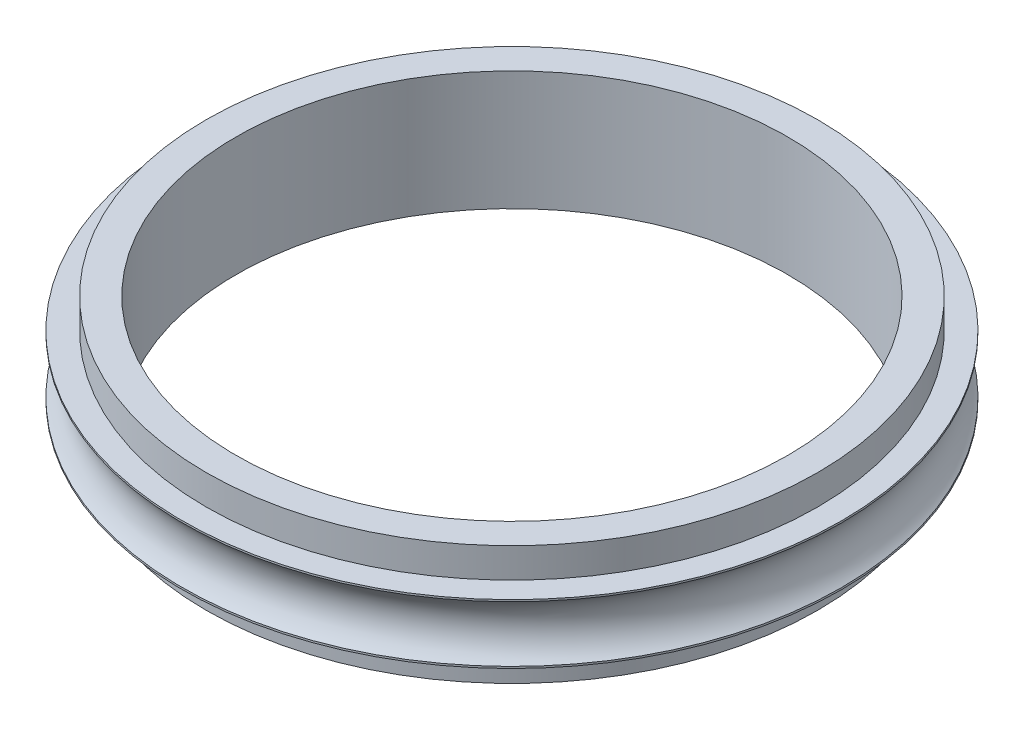
ISO-10303-21;
HEADER;
FILE_DESCRIPTION(('STEP AP214'),'2;1');
FILE_NAME('part.step','',(''),(''),'','','');
FILE_SCHEMA(('AUTOMOTIVE_DESIGN { 1 0 10303 214 1 1 1 1 }'));
ENDSEC;
DATA;
#1=APPLICATION_CONTEXT('core data for automotive mechanical design processes');
#2=APPLICATION_PROTOCOL_DEFINITION('international standard','automotive_design',2000,#1);
#3=PRODUCT_CONTEXT('',#1,'mechanical');
#4=PRODUCT('Part','Part','',(#3));
#5=PRODUCT_RELATED_PRODUCT_CATEGORY('part','',(#4));
#6=PRODUCT_DEFINITION_FORMATION('','',#4);
#7=PRODUCT_DEFINITION_CONTEXT('part definition',#1,'design');
#8=PRODUCT_DEFINITION('design','',#6,#7);
#9=PRODUCT_DEFINITION_SHAPE('','',#8);
#10=(LENGTH_UNIT() NAMED_UNIT(*) SI_UNIT(.MILLI.,.METRE.));
#11=(NAMED_UNIT(*) PLANE_ANGLE_UNIT() SI_UNIT($,.RADIAN.));
#12=(NAMED_UNIT(*) SI_UNIT($,.STERADIAN.) SOLID_ANGLE_UNIT());
#13=UNCERTAINTY_MEASURE_WITH_UNIT(LENGTH_MEASURE(1.E-05),#10,'distance_accuracy_value','');
#14=(GEOMETRIC_REPRESENTATION_CONTEXT(3) GLOBAL_UNCERTAINTY_ASSIGNED_CONTEXT((#13)) GLOBAL_UNIT_ASSIGNED_CONTEXT((#10,
#11,#12)) REPRESENTATION_CONTEXT('',''));
#15=CARTESIAN_POINT('',(0.,0.,0.));
#16=DIRECTION('',(0.,0.,1.));
#17=DIRECTION('',(1.,0.,0.));
#18=AXIS2_PLACEMENT_3D('',#15,#16,#17);
#19=CARTESIAN_POINT('',(23.75,4.4,0.));
#20=DIRECTION('',(0.,-1.,0.));
#21=DIRECTION('',(-1.,0.,0.));
#22=AXIS2_PLACEMENT_3D('',#19,#20,#21);
#23=CYLINDRICAL_SURFACE('',#22,20.5);
#24=CARTESIAN_POINT('',(23.75,2.,0.));
#25=DIRECTION('',(0.,-1.,0.));
#26=DIRECTION('',(-1.,0.,0.));
#27=AXIS2_PLACEMENT_3D('',#24,#25,#26);
#28=CIRCLE('',#27,20.5);
#29=CARTESIAN_POINT('',(44.25,2.,0.));
#30=VERTEX_POINT('',#29);
#31=EDGE_CURVE('E28',#30,#30,#28,.T.);
#32=ORIENTED_EDGE('',*,*,#31,.F.);
#33=DIRECTION('',(0.,1.,0.));
#34=VECTOR('',#33,1.);
#35=CARTESIAN_POINT('',(44.25,4.4,0.));
#36=LINE('',#35,#34);
#37=CARTESIAN_POINT('',(44.25,4.,0.));
#38=VERTEX_POINT('',#37);
#39=EDGE_CURVE('E11',#30,#38,#36,.T.);
#40=ORIENTED_EDGE('',*,*,#39,.T.);
#41=CARTESIAN_POINT('',(23.75,4.,0.));
#42=DIRECTION('',(0.,1.,0.));
#43=DIRECTION('',(-1.,0.,0.));
#44=AXIS2_PLACEMENT_3D('',#41,#42,#43);
#45=CIRCLE('',#44,20.5);
#46=EDGE_CURVE('E119',#38,#38,#45,.T.);
#47=ORIENTED_EDGE('',*,*,#46,.F.);
#48=ORIENTED_EDGE('',*,*,#39,.F.);
#49=EDGE_LOOP('',(#32,#40,#47,#48));
#50=FACE_BOUND('',#49,.T.);
#51=ADVANCED_FACE('F17',(#50),#23,.T.);
#52=CARTESIAN_POINT('',(23.75,2.,0.));
#53=DIRECTION('',(0.,-1.,0.));
#54=DIRECTION('',(0.,0.,-1.));
#55=AXIS2_PLACEMENT_3D('',#52,#53,#54);
#56=PLANE('',#55);
#57=ORIENTED_EDGE('',*,*,#31,.T.);
#58=EDGE_LOOP('',(#57));
#59=FACE_BOUND('',#58,.T.);
#60=CARTESIAN_POINT('',(23.75,2.,0.));
#61=DIRECTION('',(0.,-1.,0.));
#62=DIRECTION('',(-1.,0.,0.));
#63=AXIS2_PLACEMENT_3D('',#60,#61,#62);
#64=CIRCLE('',#63,22.1);
#65=CARTESIAN_POINT('',(45.85,2.,0.));
#66=VERTEX_POINT('',#65);
#67=EDGE_CURVE('E111',#66,#66,#64,.T.);
#68=ORIENTED_EDGE('',*,*,#67,.F.);
#69=EDGE_LOOP('',(#68));
#70=FACE_BOUND('',#69,.T.);
#71=ADVANCED_FACE('F155',(#59,#70),#56,.F.);
#72=CARTESIAN_POINT('',(23.75,4.4,0.));
#73=DIRECTION('',(0.,-1.,0.));
#74=DIRECTION('',(-1.,0.,0.));
#75=AXIS2_PLACEMENT_3D('',#72,#73,#74);
#76=CYLINDRICAL_SURFACE('',#75,22.1);
#77=CARTESIAN_POINT('',(23.75,1.878163997099,0.));
#78=DIRECTION('',(0.,-1.,0.));
#79=DIRECTION('',(-1.,0.,0.));
#80=AXIS2_PLACEMENT_3D('',#77,#78,#79);
#81=CIRCLE('',#80,22.1);
#82=CARTESIAN_POINT('',(45.85,1.878163997099,0.));
#83=VERTEX_POINT('',#82);
#84=EDGE_CURVE('E21',#83,#83,#81,.T.);
#85=ORIENTED_EDGE('',*,*,#84,.F.);
#86=DIRECTION('',(0.,1.,0.));
#87=VECTOR('',#86,1.);
#88=CARTESIAN_POINT('',(45.85,4.4,0.));
#89=LINE('',#88,#87);
#90=EDGE_CURVE('E107',#83,#66,#89,.T.);
#91=ORIENTED_EDGE('',*,*,#90,.T.);
#92=ORIENTED_EDGE('',*,*,#67,.T.);
#93=ORIENTED_EDGE('',*,*,#90,.F.);
#94=EDGE_LOOP('',(#85,#91,#92,#93));
#95=FACE_BOUND('',#94,.T.);
#96=ADVANCED_FACE('F19',(#95),#76,.T.);
#97=CARTESIAN_POINT('',(23.75,0.,0.));
#98=DIRECTION('',(0.,-1.,0.));
#99=DIRECTION('',(-1.,0.,0.));
#100=AXIS2_PLACEMENT_3D('',#97,#98,#99);
#101=TOROIDAL_SURFACE('',#100,23.75,2.5);
#102=CARTESIAN_POINT('',(23.75,-1.878163997099,0.));
#103=DIRECTION('',(0.,-1.,0.));
#104=DIRECTION('',(-1.,0.,0.));
#105=AXIS2_PLACEMENT_3D('',#102,#103,#104);
#106=CIRCLE('',#105,22.1);
#107=CARTESIAN_POINT('',(45.85,-1.878163997099,0.));
#108=VERTEX_POINT('',#107);
#109=EDGE_CURVE('E93',#108,#108,#106,.T.);
#110=ORIENTED_EDGE('',*,*,#109,.F.);
#111=CARTESIAN_POINT('',(47.5,0.,0.));
#112=DIRECTION('',(0.,0.,-1.));
#113=DIRECTION('',(1.,0.,0.));
#114=AXIS2_PLACEMENT_3D('',#111,#112,#113);
#115=CIRCLE('',#114,2.5);
#116=EDGE_CURVE('E127',#108,#83,#115,.T.);
#117=ORIENTED_EDGE('',*,*,#116,.T.);
#118=ORIENTED_EDGE('',*,*,#84,.T.);
#119=ORIENTED_EDGE('',*,*,#116,.F.);
#120=EDGE_LOOP('',(#110,#117,#118,#119));
#121=FACE_BOUND('',#120,.T.);
#122=ADVANCED_FACE('F151',(#121),#101,.F.);
#123=CARTESIAN_POINT('',(23.75,4.4,0.));
#124=DIRECTION('',(0.,-1.,0.));
#125=DIRECTION('',(-1.,0.,0.));
#126=AXIS2_PLACEMENT_3D('',#123,#124,#125);
#127=CYLINDRICAL_SURFACE('',#126,22.1);
#128=CARTESIAN_POINT('',(23.75,-2.,0.));
#129=DIRECTION('',(0.,-1.,0.));
#130=DIRECTION('',(-1.,0.,0.));
#131=AXIS2_PLACEMENT_3D('',#128,#129,#130);
#132=CIRCLE('',#131,22.1);
#133=CARTESIAN_POINT('',(45.85,-2.,0.));
#134=VERTEX_POINT('',#133);
#135=EDGE_CURVE('E91',#134,#134,#132,.T.);
#136=ORIENTED_EDGE('',*,*,#135,.F.);
#137=DIRECTION('',(0.,1.,0.));
#138=VECTOR('',#137,1.);
#139=CARTESIAN_POINT('',(45.85,4.4,0.));
#140=LINE('',#139,#138);
#141=EDGE_CURVE('E88',#134,#108,#140,.T.);
#142=ORIENTED_EDGE('',*,*,#141,.T.);
#143=ORIENTED_EDGE('',*,*,#109,.T.);
#144=ORIENTED_EDGE('',*,*,#141,.F.);
#145=EDGE_LOOP('',(#136,#142,#143,#144));
#146=FACE_BOUND('',#145,.T.);
#147=ADVANCED_FACE('F90',(#146),#127,.T.);
#148=CARTESIAN_POINT('',(23.75,-2.,0.));
#149=DIRECTION('',(0.,-1.,0.));
#150=DIRECTION('',(0.,0.,-1.));
#151=AXIS2_PLACEMENT_3D('',#148,#149,#150);
#152=PLANE('',#151);
#153=CARTESIAN_POINT('',(23.75,-2.,0.));
#154=DIRECTION('',(0.,-1.,0.));
#155=DIRECTION('',(-1.,0.,0.));
#156=AXIS2_PLACEMENT_3D('',#153,#154,#155);
#157=CIRCLE('',#156,20.5);
#158=CARTESIAN_POINT('',(44.25,-2.,0.));
#159=VERTEX_POINT('',#158);
#160=EDGE_CURVE('E99',#159,#159,#157,.T.);
#161=ORIENTED_EDGE('',*,*,#160,.F.);
#162=EDGE_LOOP('',(#161));
#163=FACE_BOUND('',#162,.T.);
#164=ORIENTED_EDGE('',*,*,#135,.T.);
#165=EDGE_LOOP('',(#164));
#166=FACE_BOUND('',#165,.T.);
#167=ADVANCED_FACE('F97',(#163,#166),#152,.T.);
#168=CARTESIAN_POINT('',(23.75,4.4,0.));
#169=DIRECTION('',(0.,-1.,0.));
#170=DIRECTION('',(-1.,0.,0.));
#171=AXIS2_PLACEMENT_3D('',#168,#169,#170);
#172=CYLINDRICAL_SURFACE('',#171,20.5);
#173=CARTESIAN_POINT('',(23.75,-4.,0.));
#174=DIRECTION('',(0.,-1.,0.));
#175=DIRECTION('',(-1.,0.,0.));
#176=AXIS2_PLACEMENT_3D('',#173,#174,#175);
#177=CIRCLE('',#176,20.5);
#178=CARTESIAN_POINT('',(44.25,-4.,0.));
#179=VERTEX_POINT('',#178);
#180=EDGE_CURVE('E112',#179,#179,#177,.T.);
#181=ORIENTED_EDGE('',*,*,#180,.F.);
#182=DIRECTION('',(0.,1.,0.));
#183=VECTOR('',#182,1.);
#184=CARTESIAN_POINT('',(44.25,4.4,0.));
#185=LINE('',#184,#183);
#186=EDGE_CURVE('E67',#179,#159,#185,.T.);
#187=ORIENTED_EDGE('',*,*,#186,.T.);
#188=ORIENTED_EDGE('',*,*,#160,.T.);
#189=ORIENTED_EDGE('',*,*,#186,.F.);
#190=EDGE_LOOP('',(#181,#187,#188,#189));
#191=FACE_BOUND('',#190,.T.);
#192=ADVANCED_FACE('F178',(#191),#172,.T.);
#193=CARTESIAN_POINT('',(23.75,-4.,0.));
#194=DIRECTION('',(0.,-1.,0.));
#195=DIRECTION('',(0.,0.,-1.));
#196=AXIS2_PLACEMENT_3D('',#193,#194,#195);
#197=PLANE('',#196);
#198=CARTESIAN_POINT('',(23.75,-4.,0.));
#199=DIRECTION('',(0.,-1.,0.));
#200=DIRECTION('',(-1.,0.,0.));
#201=AXIS2_PLACEMENT_3D('',#198,#199,#200);
#202=CIRCLE('',#201,18.5);
#203=CARTESIAN_POINT('',(42.25,-4.,0.));
#204=VERTEX_POINT('',#203);
#205=EDGE_CURVE('E80',#204,#204,#202,.T.);
#206=ORIENTED_EDGE('',*,*,#205,.F.);
#207=EDGE_LOOP('',(#206));
#208=FACE_BOUND('',#207,.T.);
#209=ORIENTED_EDGE('',*,*,#180,.T.);
#210=EDGE_LOOP('',(#209));
#211=FACE_BOUND('',#210,.T.);
#212=ADVANCED_FACE('F174',(#208,#211),#197,.T.);
#213=CARTESIAN_POINT('',(23.75,4.4,0.));
#214=DIRECTION('',(0.,-1.,0.));
#215=DIRECTION('',(-1.,0.,0.));
#216=AXIS2_PLACEMENT_3D('',#213,#214,#215);
#217=CYLINDRICAL_SURFACE('',#216,18.5);
#218=CARTESIAN_POINT('',(23.75,4.,0.));
#219=DIRECTION('',(0.,-1.,0.));
#220=DIRECTION('',(-1.,0.,0.));
#221=AXIS2_PLACEMENT_3D('',#218,#219,#220);
#222=CIRCLE('',#221,18.5);
#223=CARTESIAN_POINT('',(42.25,4.,0.));
#224=VERTEX_POINT('',#223);
#225=EDGE_CURVE('E115',#224,#224,#222,.T.);
#226=ORIENTED_EDGE('',*,*,#225,.F.);
#227=DIRECTION('',(0.,-1.,0.));
#228=VECTOR('',#227,1.);
#229=CARTESIAN_POINT('',(42.25,4.4,0.));
#230=LINE('',#229,#228);
#231=EDGE_CURVE('E118',#224,#204,#230,.T.);
#232=ORIENTED_EDGE('',*,*,#231,.T.);
#233=ORIENTED_EDGE('',*,*,#205,.T.);
#234=ORIENTED_EDGE('',*,*,#231,.F.);
#235=EDGE_LOOP('',(#226,#232,#233,#234));
#236=FACE_BOUND('',#235,.T.);
#237=ADVANCED_FACE('F172',(#236),#217,.F.);
#238=CARTESIAN_POINT('',(23.75,4.,0.));
#239=DIRECTION('',(0.,-1.,0.));
#240=DIRECTION('',(0.,0.,-1.));
#241=AXIS2_PLACEMENT_3D('',#238,#239,#240);
#242=PLANE('',#241);
#243=ORIENTED_EDGE('',*,*,#225,.T.);
#244=EDGE_LOOP('',(#243));
#245=FACE_BOUND('',#244,.T.);
#246=ORIENTED_EDGE('',*,*,#46,.T.);
#247=EDGE_LOOP('',(#246));
#248=FACE_BOUND('',#247,.T.);
#249=ADVANCED_FACE('F167',(#245,#248),#242,.F.);
#250=CLOSED_SHELL('',(#51,#71,#96,#122,#147,#167,#192,#212,#237,#249));
#251=MANIFOLD_SOLID_BREP('B1',#250);
#252=ADVANCED_BREP_SHAPE_REPRESENTATION('',(#18,#251),#14);
#253=SHAPE_DEFINITION_REPRESENTATION(#9,#252);
ENDSEC;
END-ISO-10303-21;
